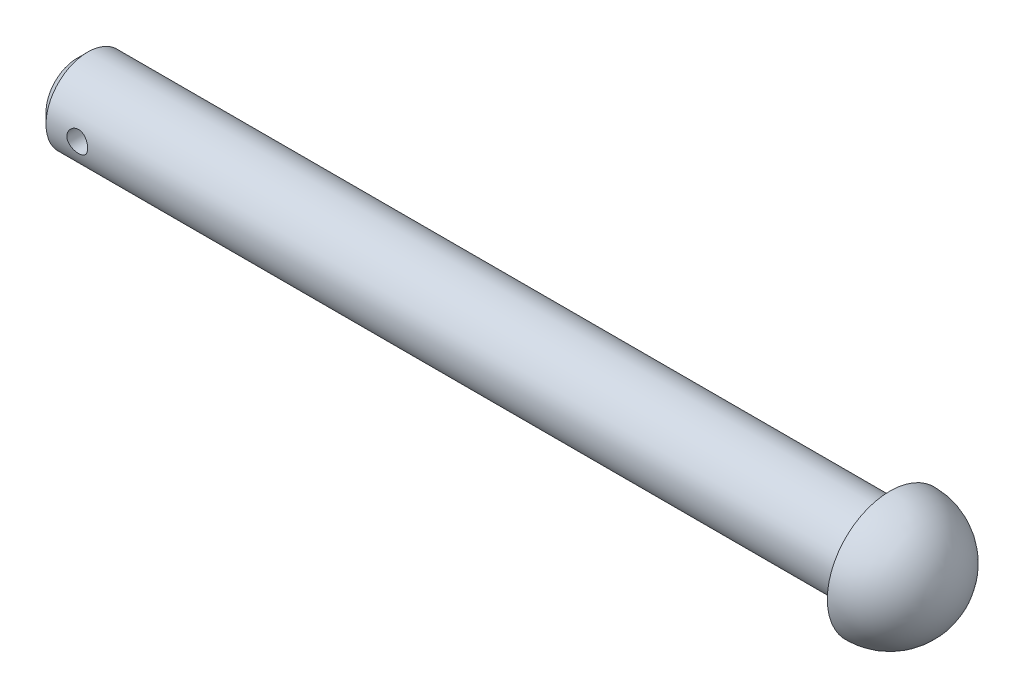
ISO-10303-21;
HEADER;
FILE_DESCRIPTION(('STEP AP214'),'2;1');
FILE_NAME('part.step','',(''),(''),'','','');
FILE_SCHEMA(('AUTOMOTIVE_DESIGN { 1 0 10303 214 1 1 1 1 }'));
ENDSEC;
DATA;
#1=APPLICATION_CONTEXT('core data for automotive mechanical design processes');
#2=APPLICATION_PROTOCOL_DEFINITION('international standard','automotive_design',2000,#1);
#3=PRODUCT_CONTEXT('',#1,'mechanical');
#4=PRODUCT('Part','Part','',(#3));
#5=PRODUCT_RELATED_PRODUCT_CATEGORY('part','',(#4));
#6=PRODUCT_DEFINITION_FORMATION('','',#4);
#7=PRODUCT_DEFINITION_CONTEXT('part definition',#1,'design');
#8=PRODUCT_DEFINITION('design','',#6,#7);
#9=PRODUCT_DEFINITION_SHAPE('','',#8);
#10=(LENGTH_UNIT() NAMED_UNIT(*) SI_UNIT(.MILLI.,.METRE.));
#11=(NAMED_UNIT(*) PLANE_ANGLE_UNIT() SI_UNIT($,.RADIAN.));
#12=(NAMED_UNIT(*) SI_UNIT($,.STERADIAN.) SOLID_ANGLE_UNIT());
#13=UNCERTAINTY_MEASURE_WITH_UNIT(LENGTH_MEASURE(1.E-05),#10,'distance_accuracy_value','');
#14=(GEOMETRIC_REPRESENTATION_CONTEXT(3) GLOBAL_UNCERTAINTY_ASSIGNED_CONTEXT((#13)) GLOBAL_UNIT_ASSIGNED_CONTEXT((#10,
#11,#12)) REPRESENTATION_CONTEXT('',''));
#15=CARTESIAN_POINT('',(0.,0.,0.));
#16=DIRECTION('',(0.,0.,1.));
#17=DIRECTION('',(1.,0.,0.));
#18=AXIS2_PLACEMENT_3D('',#15,#16,#17);
#19=CARTESIAN_POINT('',(0.,0.,0.));
#20=DIRECTION('',(1.,0.,0.));
#21=DIRECTION('',(0.,0.,-1.));
#22=AXIS2_PLACEMENT_3D('',#19,#20,#21);
#23=PLANE('',#22);
#24=CARTESIAN_POINT('',(0.,0.,0.));
#25=DIRECTION('',(1.,0.,0.));
#26=DIRECTION('',(0.,0.,-1.));
#27=AXIS2_PLACEMENT_3D('',#24,#25,#26);
#28=CIRCLE('',#27,1.49999999999999);
#29=CARTESIAN_POINT('',(0.,0.,-1.49999999999999));
#30=VERTEX_POINT('',#29);
#31=EDGE_CURVE('E52',#30,#30,#28,.F.);
#32=ORIENTED_EDGE('',*,*,#31,.T.);
#33=EDGE_LOOP('',(#32));
#34=FACE_BOUND('',#33,.T.);
#35=ADVANCED_FACE('F43',(#34),#23,.F.);
#36=CARTESIAN_POINT('',(39.,0.,0.));
#37=DIRECTION('',(-1.,0.,0.));
#38=DIRECTION('',(0.,1.,0.));
#39=AXIS2_PLACEMENT_3D('',#36,#37,#38);
#40=SPHERICAL_SURFACE('',#39,3.);
#41=CARTESIAN_POINT('',(39.,0.,0.));
#42=DIRECTION('',(-1.,0.,0.));
#43=DIRECTION('',(0.,0.,1.));
#44=AXIS2_PLACEMENT_3D('',#41,#42,#43);
#45=CIRCLE('',#44,3.);
#46=CARTESIAN_POINT('',(39.,0.,3.));
#47=VERTEX_POINT('',#46);
#48=EDGE_CURVE('E57',#47,#47,#45,.T.);
#49=ORIENTED_EDGE('',*,*,#48,.F.);
#50=EDGE_LOOP('',(#49));
#51=FACE_BOUND('',#50,.T.);
#52=ADVANCED_FACE('F95',(#51),#40,.T.);
#53=CARTESIAN_POINT('',(39.,2.,0.));
#54=DIRECTION('',(1.,0.,0.));
#55=DIRECTION('',(0.,0.,-1.));
#56=AXIS2_PLACEMENT_3D('',#53,#54,#55);
#57=PLANE('',#56);
#58=CARTESIAN_POINT('',(39.,0.,0.));
#59=DIRECTION('',(-1.,0.,0.));
#60=DIRECTION('',(0.,0.,1.));
#61=AXIS2_PLACEMENT_3D('',#58,#59,#60);
#62=CIRCLE('',#61,2.);
#63=CARTESIAN_POINT('',(39.,0.,2.));
#64=VERTEX_POINT('',#63);
#65=EDGE_CURVE('E62',#64,#64,#62,.T.);
#66=ORIENTED_EDGE('',*,*,#65,.F.);
#67=EDGE_LOOP('',(#66));
#68=FACE_BOUND('',#67,.T.);
#69=ORIENTED_EDGE('',*,*,#48,.T.);
#70=EDGE_LOOP('',(#69));
#71=FACE_BOUND('',#70,.T.);
#72=ADVANCED_FACE('F91',(#68,#71),#57,.F.);
#73=CARTESIAN_POINT('',(0.,0.,0.));
#74=DIRECTION('',(-1.,0.,0.));
#75=DIRECTION('',(0.,0.,1.));
#76=AXIS2_PLACEMENT_3D('',#73,#74,#75);
#77=CYLINDRICAL_SURFACE('',#76,2.);
#78=CARTESIAN_POINT('',(0.500000000000002,0.,0.));
#79=DIRECTION('',(1.,0.,0.));
#80=DIRECTION('',(0.,0.,-1.));
#81=AXIS2_PLACEMENT_3D('',#78,#79,#80);
#82=CIRCLE('',#81,2.);
#83=CARTESIAN_POINT('',(0.500000000000002,0.,-2.));
#84=VERTEX_POINT('',#83);
#85=EDGE_CURVE('E10',#84,#84,#82,.T.);
#86=ORIENTED_EDGE('',*,*,#85,.T.);
#87=EDGE_LOOP('',(#86));
#88=FACE_BOUND('',#87,.T.);
#89=CARTESIAN_POINT('',(2.5,0.,2.));
#90=CARTESIAN_POINT('',(2.49999922475395,-0.0276253628899104,1.99999953289338));
#91=CARTESIAN_POINT('',(2.49770281640874,-0.0552593859435878,1.99942192710609));
#92=CARTESIAN_POINT('',(2.488591616231,-0.109735441256844,1.99717371276631));
#93=CARTESIAN_POINT('',(2.48177426348738,-0.13657701562358,1.99550248473323));
#94=CARTESIAN_POINT('',(2.4638535821793,-0.188673624060859,1.99125208777347));
#95=CARTESIAN_POINT('',(2.45275540042824,-0.213930521143334,1.98867400947362));
#96=CARTESIAN_POINT('',(2.42660620331839,-0.262224043968142,1.98288447935864));
#97=CARTESIAN_POINT('',(2.41155505462702,-0.28526059478292,1.97967300618017));
#98=CARTESIAN_POINT('',(2.37759973678193,-0.328933975766973,1.97289137863934));
#99=CARTESIAN_POINT('',(2.35862947501361,-0.349518563353691,1.96931569049511));
#100=CARTESIAN_POINT('',(2.31751593169703,-0.387249642401101,1.96224540039176));
#101=CARTESIAN_POINT('',(2.29537229235117,-0.404395745649712,1.95875080762783));
#102=CARTESIAN_POINT('',(2.24813492442085,-0.435008847599677,1.9521825856657));
#103=CARTESIAN_POINT('',(2.22300225639653,-0.448417405308452,1.94911598156868));
#104=CARTESIAN_POINT('',(2.17075052944721,-0.470798969516842,1.94383164937408));
#105=CARTESIAN_POINT('',(2.14363178889141,-0.479772685146444,1.94161378557596));
#106=CARTESIAN_POINT('',(2.08875216726584,-0.492851612268097,1.93833492239184));
#107=CARTESIAN_POINT('',(2.06101503465007,-0.497050756111113,1.93725163691809));
#108=CARTESIAN_POINT('',(2.00521047699534,-0.500753925022617,1.9362978751258));
#109=CARTESIAN_POINT('',(1.9771431064338,-0.500258713939326,1.93642720149548));
#110=CARTESIAN_POINT('',(1.92219473075184,-0.49466217487976,1.93786401832206));
#111=CARTESIAN_POINT('',(1.89530145951163,-0.489672780063507,1.93914287667293));
#112=CARTESIAN_POINT('',(1.8427463163629,-0.475408062301035,1.94268903225495));
#113=CARTESIAN_POINT('',(1.81708453232367,-0.466132434023141,1.94495639990232));
#114=CARTESIAN_POINT('',(1.76742066124931,-0.443463159312384,1.95025037968062));
#115=CARTESIAN_POINT('',(1.74343794273682,-0.430028889077637,1.95328442489807));
#116=CARTESIAN_POINT('',(1.69802709674772,-0.399452092004985,1.95976570282129));
#117=CARTESIAN_POINT('',(1.67659941731091,-0.382308916269613,1.96321300778245));
#118=CARTESIAN_POINT('',(1.6362654614352,-0.344221141560406,1.9702529351326));
#119=CARTESIAN_POINT('',(1.61744850331288,-0.323182086055286,1.9738468982599));
#120=CARTESIAN_POINT('',(1.5835929191787,-0.278203972501233,1.98068655192929));
#121=CARTESIAN_POINT('',(1.56855440857881,-0.254264825902648,1.98393223183138));
#122=CARTESIAN_POINT('',(1.54264980459187,-0.204038629560464,1.98972577364727));
#123=CARTESIAN_POINT('',(1.53179821991519,-0.177743797736208,1.99227120042575));
#124=CARTESIAN_POINT('',(1.51469423143014,-0.123625336047627,1.99635972330473));
#125=CARTESIAN_POINT('',(1.50844094786062,-0.095801999716828,1.99790301113094));
#126=CARTESIAN_POINT('',(1.50084747814705,-0.0401799901300087,1.99978499757125));
#127=CARTESIAN_POINT('',(1.4993856579749,-0.0123989066627364,2.00015351169426));
#128=CARTESIAN_POINT('',(1.50108300068516,0.0430109582671695,1.9997293493815));
#129=CARTESIAN_POINT('',(1.50424174759971,0.0706397532148652,1.99893677747282));
#130=CARTESIAN_POINT('',(1.51499030279713,0.124538089592164,1.99629860375786));
#131=CARTESIAN_POINT('',(1.52251375449233,0.150821706322918,1.99446878061937));
#132=CARTESIAN_POINT('',(1.54170236134282,0.201752430817504,1.98996235544711));
#133=CARTESIAN_POINT('',(1.55336793477106,0.226399373010878,1.98728566789964));
#134=CARTESIAN_POINT('',(1.58074537629158,0.273841044809949,1.98131102642103));
#135=CARTESIAN_POINT('',(1.59652537079892,0.29659514727861,1.97800289122311));
#136=CARTESIAN_POINT('',(1.63159663626566,0.339175537881082,1.97114836395806));
#137=CARTESIAN_POINT('',(1.65088851320564,0.359001319657669,1.96760193083902));
#138=CARTESIAN_POINT('',(1.69300065361482,0.39566352269091,1.96056318986924));
#139=CARTESIAN_POINT('',(1.71589590100081,0.412414622540677,1.95707434729094));
#140=CARTESIAN_POINT('',(1.76424421148857,0.441836919670899,1.95064292792413));
#141=CARTESIAN_POINT('',(1.78969716098658,0.454508298052646,1.94770032689009));
#142=CARTESIAN_POINT('',(1.84230190747103,0.475317140203097,1.94272698244888));
#143=CARTESIAN_POINT('',(1.86944254278134,0.483481465551355,1.94069085097302));
#144=CARTESIAN_POINT('',(1.92476987929637,0.495115219984593,1.93775581363394));
#145=CARTESIAN_POINT('',(1.95295635034416,0.498585675826219,1.93685665906645));
#146=CARTESIAN_POINT('',(2.00870700795173,0.500679530111331,1.93631633734652));
#147=CARTESIAN_POINT('',(2.03626581170824,0.499439299260039,1.93663977576088));
#148=CARTESIAN_POINT('',(2.09076796288933,0.492459092770955,1.93842636335948));
#149=CARTESIAN_POINT('',(2.11771132267122,0.486719207562256,1.93988948963952));
#150=CARTESIAN_POINT('',(2.17006948635514,0.470977106480931,1.94377086894241));
#151=CARTESIAN_POINT('',(2.19549243508007,0.461000468226792,1.94618338412103));
#152=CARTESIAN_POINT('',(2.2443217942379,0.437088304535023,1.95169251908276));
#153=CARTESIAN_POINT('',(2.26772792439564,0.423152230011396,1.95478923373591));
#154=CARTESIAN_POINT('',(2.31251820966734,0.391289249545712,1.96141878087837));
#155=CARTESIAN_POINT('',(2.33383369114132,0.373267720970751,1.96496088277252));
#156=CARTESIAN_POINT('',(2.37318234826514,0.333929790396578,1.97202675748762));
#157=CARTESIAN_POINT('',(2.39121474337099,0.312612607087048,1.97555052575687));
#158=CARTESIAN_POINT('',(2.42380376952154,0.266822528900863,1.98225885215888));
#159=CARTESIAN_POINT('',(2.43829153789053,0.242299474105462,1.98543611121956));
#160=CARTESIAN_POINT('',(2.46291582098018,0.191088686503492,1.99101641658373));
#161=CARTESIAN_POINT('',(2.47305545354951,0.16440252114558,1.9934200173326));
#162=CARTESIAN_POINT('',(2.48719061010988,0.114803417747824,1.99682686521847));
#163=CARTESIAN_POINT('',(2.49198374768448,0.0921267236360226,1.9980086168423));
#164=CARTESIAN_POINT('',(2.49838864787398,0.0463020238454276,1.99959535077316));
#165=CARTESIAN_POINT('',(2.50000064976843,0.0231540537475387,2.00000039150298));
#166=CARTESIAN_POINT('',(2.5,0.,2.));
#167=B_SPLINE_CURVE_WITH_KNOTS('',3,(#89,#90,#91,#92,#93,#94,#95,#96,#97,#98,#99,#100,#101,#102,
#103,#104,#105,#106,#107,#108,#109,#110,#111,#112,#113,#114,#115,#116,#117,#118,#119,#120,#121,
#122,#123,#124,#125,#126,#127,#128,#129,#130,#131,#132,#133,#134,#135,#136,#137,#138,#139,#140,
#141,#142,#143,#144,#145,#146,#147,#148,#149,#150,#151,#152,#153,#154,#155,#156,#157,#158,#159,
#160,#161,#162,#163,#164,#165,#166),.UNSPECIFIED.,.T.,.F.,(4,2,2,2,2,2,2,2,2,2,2,2,2,2,2,2,2,2,
2,2,2,2,2,2,2,2,2,2,2,2,2,2,2,2,2,2,2,2,4),(0.,0.0827912374906299,0.165629412587967,
0.248368300762035,0.331109980056443,0.41538145145713,0.49966243193354,0.585195491819357,
0.670714870564561,0.754520983664767,0.838313460375656,0.920074990023393,1.00184234488679,
1.08443509291293,1.16704230278721,1.25200500323006,1.33697029852749,1.42222743003038,
1.50746824562881,1.59052769649759,1.67357967037581,1.75540091504679,1.83723042440763,
1.92051195855117,2.0038078766934,2.08914836401492,2.17448506249836,2.25930751538012,
2.34411141084136,2.42647926799537,2.50884546985345,2.59072133519816,2.67260856045634,
2.75663192136637,2.84067523256806,2.92624061833196,3.01174454607117,3.08114080980716,
3.1505318534768),.UNSPECIFIED.);
#168=CARTESIAN_POINT('',(2.5,0.,2.));
#169=VERTEX_POINT('',#168);
#170=EDGE_CURVE('E65',#169,#169,#167,.T.);
#171=ORIENTED_EDGE('',*,*,#170,.T.);
#172=EDGE_LOOP('',(#171));
#173=FACE_BOUND('',#172,.T.);
#174=CARTESIAN_POINT('',(2.5,0.,-2.));
#175=CARTESIAN_POINT('',(2.49999922475395,0.0276253628899104,-1.99999953289338));
#176=CARTESIAN_POINT('',(2.49770281640874,0.0552593859435878,-1.99942192710609));
#177=CARTESIAN_POINT('',(2.488591616231,0.109735441256844,-1.99717371276631));
#178=CARTESIAN_POINT('',(2.48177426348738,0.13657701562358,-1.99550248473323));
#179=CARTESIAN_POINT('',(2.4638535821793,0.188673624060859,-1.99125208777347));
#180=CARTESIAN_POINT('',(2.45275540042824,0.213930521143334,-1.98867400947362));
#181=CARTESIAN_POINT('',(2.42660620331839,0.262224043968142,-1.98288447935864));
#182=CARTESIAN_POINT('',(2.41155505462702,0.28526059478292,-1.97967300618017));
#183=CARTESIAN_POINT('',(2.37759973678193,0.328933975766973,-1.97289137863934));
#184=CARTESIAN_POINT('',(2.35862947501361,0.349518563353691,-1.96931569049511));
#185=CARTESIAN_POINT('',(2.31751593169703,0.387249642401101,-1.96224540039176));
#186=CARTESIAN_POINT('',(2.29537229235117,0.404395745649712,-1.95875080762783));
#187=CARTESIAN_POINT('',(2.24813492442085,0.435008847599677,-1.9521825856657));
#188=CARTESIAN_POINT('',(2.22300225639653,0.448417405308452,-1.94911598156868));
#189=CARTESIAN_POINT('',(2.17075052944721,0.470798969516842,-1.94383164937408));
#190=CARTESIAN_POINT('',(2.14363178889141,0.479772685146444,-1.94161378557596));
#191=CARTESIAN_POINT('',(2.08875216726584,0.492851612268097,-1.93833492239184));
#192=CARTESIAN_POINT('',(2.06101503465007,0.497050756111113,-1.93725163691809));
#193=CARTESIAN_POINT('',(2.00521047699534,0.500753925022617,-1.9362978751258));
#194=CARTESIAN_POINT('',(1.9771431064338,0.500258713939326,-1.93642720149548));
#195=CARTESIAN_POINT('',(1.92219473075184,0.49466217487976,-1.93786401832206));
#196=CARTESIAN_POINT('',(1.89530145951163,0.489672780063507,-1.93914287667293));
#197=CARTESIAN_POINT('',(1.8427463163629,0.475408062301035,-1.94268903225495));
#198=CARTESIAN_POINT('',(1.81708453232367,0.466132434023141,-1.94495639990232));
#199=CARTESIAN_POINT('',(1.76742066124931,0.443463159312384,-1.95025037968062));
#200=CARTESIAN_POINT('',(1.74343794273682,0.430028889077637,-1.95328442489807));
#201=CARTESIAN_POINT('',(1.69802709674772,0.399452092004985,-1.95976570282129));
#202=CARTESIAN_POINT('',(1.67659941731091,0.382308916269613,-1.96321300778245));
#203=CARTESIAN_POINT('',(1.6362654614352,0.344221141560406,-1.9702529351326));
#204=CARTESIAN_POINT('',(1.61744850331288,0.323182086055286,-1.9738468982599));
#205=CARTESIAN_POINT('',(1.5835929191787,0.278203972501233,-1.98068655192929));
#206=CARTESIAN_POINT('',(1.56855440857881,0.254264825902648,-1.98393223183138));
#207=CARTESIAN_POINT('',(1.54264980459187,0.204038629560464,-1.98972577364727));
#208=CARTESIAN_POINT('',(1.53179821991519,0.177743797736208,-1.99227120042575));
#209=CARTESIAN_POINT('',(1.51469423143014,0.123625336047627,-1.99635972330473));
#210=CARTESIAN_POINT('',(1.50844094786062,0.095801999716828,-1.99790301113094));
#211=CARTESIAN_POINT('',(1.50084747814705,0.0401799901300087,-1.99978499757125));
#212=CARTESIAN_POINT('',(1.4993856579749,0.0123989066627364,-2.00015351169426));
#213=CARTESIAN_POINT('',(1.50108300068516,-0.0430109582671695,-1.9997293493815));
#214=CARTESIAN_POINT('',(1.50424174759971,-0.0706397532148652,-1.99893677747282));
#215=CARTESIAN_POINT('',(1.51499030279713,-0.124538089592164,-1.99629860375786));
#216=CARTESIAN_POINT('',(1.52251375449233,-0.150821706322918,-1.99446878061937));
#217=CARTESIAN_POINT('',(1.54170236134282,-0.201752430817504,-1.98996235544711));
#218=CARTESIAN_POINT('',(1.55336793477106,-0.226399373010878,-1.98728566789964));
#219=CARTESIAN_POINT('',(1.58074537629158,-0.273841044809949,-1.98131102642103));
#220=CARTESIAN_POINT('',(1.59652537079892,-0.29659514727861,-1.97800289122311));
#221=CARTESIAN_POINT('',(1.63159663626566,-0.339175537881082,-1.97114836395806));
#222=CARTESIAN_POINT('',(1.65088851320564,-0.359001319657669,-1.96760193083902));
#223=CARTESIAN_POINT('',(1.69300065361482,-0.39566352269091,-1.96056318986924));
#224=CARTESIAN_POINT('',(1.71589590100081,-0.412414622540677,-1.95707434729094));
#225=CARTESIAN_POINT('',(1.76424421148857,-0.441836919670899,-1.95064292792413));
#226=CARTESIAN_POINT('',(1.78969716098658,-0.454508298052646,-1.94770032689009));
#227=CARTESIAN_POINT('',(1.84230190747103,-0.475317140203097,-1.94272698244888));
#228=CARTESIAN_POINT('',(1.86944254278134,-0.483481465551355,-1.94069085097302));
#229=CARTESIAN_POINT('',(1.92476987929637,-0.495115219984593,-1.93775581363394));
#230=CARTESIAN_POINT('',(1.95295635034416,-0.498585675826219,-1.93685665906645));
#231=CARTESIAN_POINT('',(2.00870700795173,-0.500679530111331,-1.93631633734652));
#232=CARTESIAN_POINT('',(2.03626581170824,-0.499439299260039,-1.93663977576088));
#233=CARTESIAN_POINT('',(2.09076796288933,-0.492459092770955,-1.93842636335948));
#234=CARTESIAN_POINT('',(2.11771132267122,-0.486719207562256,-1.93988948963952));
#235=CARTESIAN_POINT('',(2.17006948635514,-0.470977106480931,-1.94377086894241));
#236=CARTESIAN_POINT('',(2.19549243508007,-0.461000468226792,-1.94618338412103));
#237=CARTESIAN_POINT('',(2.2443217942379,-0.437088304535023,-1.95169251908276));
#238=CARTESIAN_POINT('',(2.26772792439564,-0.423152230011396,-1.95478923373591));
#239=CARTESIAN_POINT('',(2.31251820966734,-0.391289249545712,-1.96141878087837));
#240=CARTESIAN_POINT('',(2.33383369114132,-0.373267720970751,-1.96496088277252));
#241=CARTESIAN_POINT('',(2.37318234826514,-0.333929790396578,-1.97202675748762));
#242=CARTESIAN_POINT('',(2.39121474337099,-0.312612607087048,-1.97555052575687));
#243=CARTESIAN_POINT('',(2.42380376952154,-0.266822528900863,-1.98225885215888));
#244=CARTESIAN_POINT('',(2.43829153789053,-0.242299474105462,-1.98543611121956));
#245=CARTESIAN_POINT('',(2.46291582098018,-0.191088686503492,-1.99101641658373));
#246=CARTESIAN_POINT('',(2.47305545354951,-0.16440252114558,-1.9934200173326));
#247=CARTESIAN_POINT('',(2.48719061010988,-0.114803417747824,-1.99682686521847));
#248=CARTESIAN_POINT('',(2.49198374768448,-0.0921267236360226,-1.9980086168423));
#249=CARTESIAN_POINT('',(2.49838864787398,-0.0463020238454276,-1.99959535077316));
#250=CARTESIAN_POINT('',(2.50000064976843,-0.0231540537475387,-2.00000039150298));
#251=CARTESIAN_POINT('',(2.5,0.,-2.));
#252=B_SPLINE_CURVE_WITH_KNOTS('',3,(#174,#175,#176,#177,#178,#179,#180,#181,#182,#183,#184,
#185,#186,#187,#188,#189,#190,#191,#192,#193,#194,#195,#196,#197,#198,#199,#200,#201,#202,#203,
#204,#205,#206,#207,#208,#209,#210,#211,#212,#213,#214,#215,#216,#217,#218,#219,#220,#221,#222,
#223,#224,#225,#226,#227,#228,#229,#230,#231,#232,#233,#234,#235,#236,#237,#238,#239,#240,#241,
#242,#243,#244,#245,#246,#247,#248,#249,#250,#251),.UNSPECIFIED.,.T.,.F.,(4,2,2,2,2,2,2,2,2,2,2,
2,2,2,2,2,2,2,2,2,2,2,2,2,2,2,2,2,2,2,2,2,2,2,2,2,2,2,4),(0.,0.0827912374906299,
0.165629412587967,0.248368300762035,0.331109980056443,0.41538145145713,0.49966243193354,
0.585195491819357,0.670714870564561,0.754520983664767,0.838313460375656,0.920074990023393,
1.00184234488679,1.08443509291293,1.16704230278721,1.25200500323006,1.33697029852749,
1.42222743003038,1.50746824562881,1.59052769649759,1.67357967037581,1.75540091504679,
1.83723042440763,1.92051195855117,2.0038078766934,2.08914836401492,2.17448506249836,
2.25930751538012,2.34411141084136,2.42647926799537,2.50884546985345,2.59072133519816,
2.67260856045634,2.75663192136637,2.84067523256806,2.92624061833196,3.01174454607117,
3.08114080980716,3.1505318534768),.UNSPECIFIED.);
#253=CARTESIAN_POINT('',(2.5,0.,-2.));
#254=VERTEX_POINT('',#253);
#255=EDGE_CURVE('E74',#254,#254,#252,.T.);
#256=ORIENTED_EDGE('',*,*,#255,.T.);
#257=EDGE_LOOP('',(#256));
#258=FACE_BOUND('',#257,.T.);
#259=ORIENTED_EDGE('',*,*,#65,.T.);
#260=EDGE_LOOP('',(#259));
#261=FACE_BOUND('',#260,.T.);
#262=ADVANCED_FACE('F78',(#88,#173,#258,#261),#77,.T.);
#263=CARTESIAN_POINT('',(2.,0.,-3.));
#264=DIRECTION('',(0.,0.,1.));
#265=DIRECTION('',(1.,0.,0.));
#266=AXIS2_PLACEMENT_3D('',#263,#264,#265);
#267=CYLINDRICAL_SURFACE('',#266,0.5);
#268=ORIENTED_EDGE('',*,*,#255,.F.);
#269=EDGE_LOOP('',(#268));
#270=FACE_BOUND('',#269,.T.);
#271=ORIENTED_EDGE('',*,*,#170,.F.);
#272=EDGE_LOOP('',(#271));
#273=FACE_BOUND('',#272,.T.);
#274=ADVANCED_FACE('F81',(#270,#273),#267,.F.);
#275=CARTESIAN_POINT('',(0.,0.,0.));
#276=DIRECTION('',(1.,0.,0.));
#277=DIRECTION('',(0.,0.,-1.));
#278=AXIS2_PLACEMENT_3D('',#275,#276,#277);
#279=CONICAL_SURFACE('',#278,1.49999999999999,0.785398163397452);
#280=ORIENTED_EDGE('',*,*,#85,.F.);
#281=EDGE_LOOP('',(#280));
#282=FACE_BOUND('',#281,.T.);
#283=ORIENTED_EDGE('',*,*,#31,.F.);
#284=EDGE_LOOP('',(#283));
#285=FACE_BOUND('',#284,.T.);
#286=ADVANCED_FACE('F46',(#282,#285),#279,.T.);
#287=CLOSED_SHELL('',(#35,#52,#72,#262,#274,#286));
#288=MANIFOLD_SOLID_BREP('B2',#287);
#289=ADVANCED_BREP_SHAPE_REPRESENTATION('',(#18,#288),#14);
#290=SHAPE_DEFINITION_REPRESENTATION(#9,#289);
ENDSEC;
END-ISO-10303-21;
